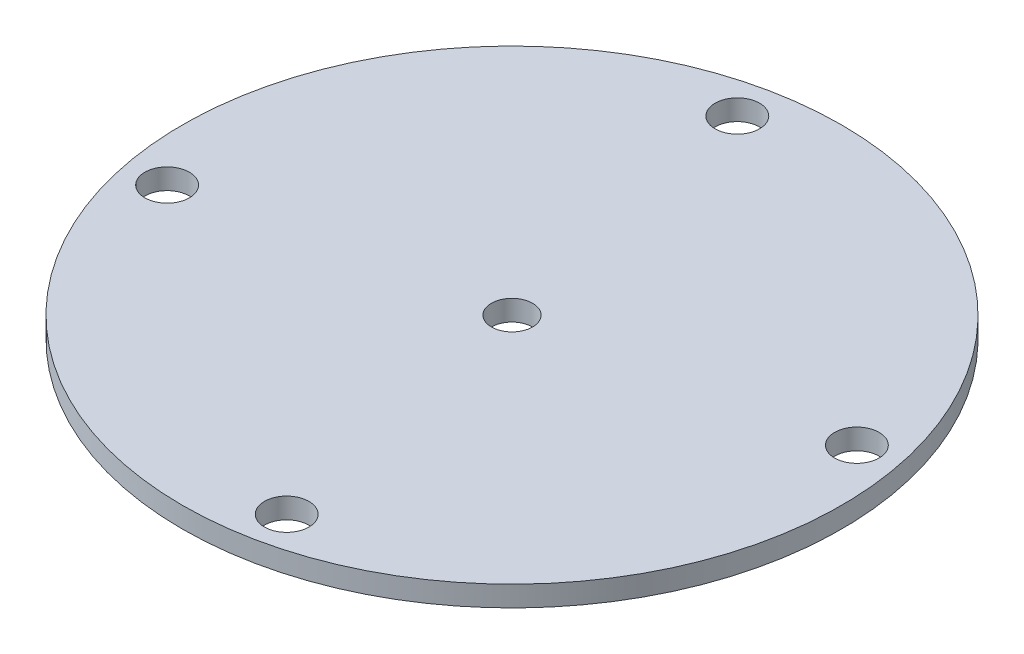
ISO-10303-21;
HEADER;
FILE_DESCRIPTION(('STEP AP214'),'2;1');
FILE_NAME('part.step','',(''),(''),'','','');
FILE_SCHEMA(('AUTOMOTIVE_DESIGN { 1 0 10303 214 1 1 1 1 }'));
ENDSEC;
DATA;
#1=APPLICATION_CONTEXT('core data for automotive mechanical design processes');
#2=APPLICATION_PROTOCOL_DEFINITION('international standard','automotive_design',2000,#1);
#3=PRODUCT_CONTEXT('',#1,'mechanical');
#4=PRODUCT('Part','Part','',(#3));
#5=PRODUCT_RELATED_PRODUCT_CATEGORY('part','',(#4));
#6=PRODUCT_DEFINITION_FORMATION('','',#4);
#7=PRODUCT_DEFINITION_CONTEXT('part definition',#1,'design');
#8=PRODUCT_DEFINITION('design','',#6,#7);
#9=PRODUCT_DEFINITION_SHAPE('','',#8);
#10=(LENGTH_UNIT() NAMED_UNIT(*) SI_UNIT(.MILLI.,.METRE.));
#11=(NAMED_UNIT(*) PLANE_ANGLE_UNIT() SI_UNIT($,.RADIAN.));
#12=(NAMED_UNIT(*) SI_UNIT($,.STERADIAN.) SOLID_ANGLE_UNIT());
#13=UNCERTAINTY_MEASURE_WITH_UNIT(LENGTH_MEASURE(1.E-05),#10,'distance_accuracy_value','');
#14=(GEOMETRIC_REPRESENTATION_CONTEXT(3) GLOBAL_UNCERTAINTY_ASSIGNED_CONTEXT((#13)) GLOBAL_UNIT_ASSIGNED_CONTEXT((#10,
#11,#12)) REPRESENTATION_CONTEXT('',''));
#15=CARTESIAN_POINT('',(0.,0.,0.));
#16=DIRECTION('',(0.,0.,1.));
#17=DIRECTION('',(1.,0.,0.));
#18=AXIS2_PLACEMENT_3D('',#15,#16,#17);
#19=CARTESIAN_POINT('',(0.,3.175,0.));
#20=DIRECTION('',(0.,1.,0.));
#21=DIRECTION('',(0.,0.,1.));
#22=AXIS2_PLACEMENT_3D('',#19,#20,#21);
#23=PLANE('',#22);
#24=CARTESIAN_POINT('',(9.21464266183947,3.175,43.9455954631929));
#25=DIRECTION('',(0.,1.,0.));
#26=DIRECTION('',(0.,0.,1.));
#27=AXIS2_PLACEMENT_3D('',#24,#25,#26);
#28=CIRCLE('',#27,3.429);
#29=CARTESIAN_POINT('',(9.21464266183947,3.175,47.3745954631929));
#30=VERTEX_POINT('',#29);
#31=EDGE_CURVE('E74',#30,#30,#28,.T.);
#32=ORIENTED_EDGE('',*,*,#31,.F.);
#33=EDGE_LOOP('',(#32));
#34=FACE_BOUND('',#33,.T.);
#35=CARTESIAN_POINT('',(43.9455954631928,3.175,-9.2146426618397));
#36=DIRECTION('',(0.,1.,0.));
#37=DIRECTION('',(0.,0.,1.));
#38=AXIS2_PLACEMENT_3D('',#35,#36,#37);
#39=CIRCLE('',#38,3.429);
#40=CARTESIAN_POINT('',(43.9455954631928,3.175,-5.7856426618397));
#41=VERTEX_POINT('',#40);
#42=EDGE_CURVE('E68',#41,#41,#39,.T.);
#43=ORIENTED_EDGE('',*,*,#42,.F.);
#44=EDGE_LOOP('',(#43));
#45=FACE_BOUND('',#44,.T.);
#46=CARTESIAN_POINT('',(-43.9455954631932,3.175,9.21464266183964));
#47=DIRECTION('',(0.,1.,0.));
#48=DIRECTION('',(0.,0.,1.));
#49=AXIS2_PLACEMENT_3D('',#46,#47,#48);
#50=CIRCLE('',#49,3.429);
#51=CARTESIAN_POINT('',(-43.9455954631932,3.175,12.6436426618396));
#52=VERTEX_POINT('',#51);
#53=EDGE_CURVE('E62',#52,#52,#50,.T.);
#54=ORIENTED_EDGE('',*,*,#53,.F.);
#55=EDGE_LOOP('',(#54));
#56=FACE_BOUND('',#55,.T.);
#57=CARTESIAN_POINT('',(-9.21464266183987,3.175,-43.945595463193));
#58=DIRECTION('',(0.,1.,0.));
#59=DIRECTION('',(0.,0.,1.));
#60=AXIS2_PLACEMENT_3D('',#57,#58,#59);
#61=CIRCLE('',#60,3.429);
#62=CARTESIAN_POINT('',(-9.21464266183987,3.175,-40.516595463193));
#63=VERTEX_POINT('',#62);
#64=EDGE_CURVE('E56',#63,#63,#61,.T.);
#65=ORIENTED_EDGE('',*,*,#64,.F.);
#66=EDGE_LOOP('',(#65));
#67=FACE_BOUND('',#66,.T.);
#68=CARTESIAN_POINT('',(0.,3.175,0.));
#69=DIRECTION('',(0.,1.,0.));
#70=DIRECTION('',(0.,0.,1.));
#71=AXIS2_PLACEMENT_3D('',#68,#69,#70);
#72=CIRCLE('',#71,50.8);
#73=CARTESIAN_POINT('',(0.,3.175,50.8));
#74=VERTEX_POINT('',#73);
#75=EDGE_CURVE('E11',#74,#74,#72,.T.);
#76=ORIENTED_EDGE('',*,*,#75,.T.);
#77=EDGE_LOOP('',(#76));
#78=FACE_BOUND('',#77,.T.);
#79=CARTESIAN_POINT('',(0.,3.175,0.));
#80=DIRECTION('',(0.,1.,0.));
#81=DIRECTION('',(0.,0.,1.));
#82=AXIS2_PLACEMENT_3D('',#79,#80,#81);
#83=CIRCLE('',#82,3.175);
#84=CARTESIAN_POINT('',(0.,3.175,3.175));
#85=VERTEX_POINT('',#84);
#86=EDGE_CURVE('E48',#85,#85,#83,.T.);
#87=ORIENTED_EDGE('',*,*,#86,.F.);
#88=EDGE_LOOP('',(#87));
#89=FACE_BOUND('',#88,.T.);
#90=ADVANCED_FACE('F37',(#34,#45,#56,#67,#78,#89),#23,.T.);
#91=CARTESIAN_POINT('',(0.,0.,0.));
#92=DIRECTION('',(0.,1.,0.));
#93=DIRECTION('',(0.,0.,1.));
#94=AXIS2_PLACEMENT_3D('',#91,#92,#93);
#95=PLANE('',#94);
#96=CARTESIAN_POINT('',(9.21464266183947,0.,43.9455954631929));
#97=DIRECTION('',(0.,1.,0.));
#98=DIRECTION('',(0.,0.,1.));
#99=AXIS2_PLACEMENT_3D('',#96,#97,#98);
#100=CIRCLE('',#99,3.429);
#101=CARTESIAN_POINT('',(9.21464266183947,0.,47.3745954631929));
#102=VERTEX_POINT('',#101);
#103=EDGE_CURVE('E71',#102,#102,#100,.T.);
#104=ORIENTED_EDGE('',*,*,#103,.T.);
#105=EDGE_LOOP('',(#104));
#106=FACE_BOUND('',#105,.T.);
#107=CARTESIAN_POINT('',(43.9455954631928,0.,-9.2146426618397));
#108=DIRECTION('',(0.,1.,0.));
#109=DIRECTION('',(0.,0.,1.));
#110=AXIS2_PLACEMENT_3D('',#107,#108,#109);
#111=CIRCLE('',#110,3.429);
#112=CARTESIAN_POINT('',(43.9455954631928,0.,-5.7856426618397));
#113=VERTEX_POINT('',#112);
#114=EDGE_CURVE('E65',#113,#113,#111,.T.);
#115=ORIENTED_EDGE('',*,*,#114,.T.);
#116=EDGE_LOOP('',(#115));
#117=FACE_BOUND('',#116,.T.);
#118=CARTESIAN_POINT('',(-43.9455954631932,0.,9.21464266183964));
#119=DIRECTION('',(0.,1.,0.));
#120=DIRECTION('',(0.,0.,1.));
#121=AXIS2_PLACEMENT_3D('',#118,#119,#120);
#122=CIRCLE('',#121,3.429);
#123=CARTESIAN_POINT('',(-43.9455954631932,0.,12.6436426618396));
#124=VERTEX_POINT('',#123);
#125=EDGE_CURVE('E59',#124,#124,#122,.T.);
#126=ORIENTED_EDGE('',*,*,#125,.T.);
#127=EDGE_LOOP('',(#126));
#128=FACE_BOUND('',#127,.T.);
#129=CARTESIAN_POINT('',(-9.21464266183987,0.,-43.945595463193));
#130=DIRECTION('',(0.,1.,0.));
#131=DIRECTION('',(0.,0.,1.));
#132=AXIS2_PLACEMENT_3D('',#129,#130,#131);
#133=CIRCLE('',#132,3.429);
#134=CARTESIAN_POINT('',(-9.21464266183987,0.,-40.516595463193));
#135=VERTEX_POINT('',#134);
#136=EDGE_CURVE('E53',#135,#135,#133,.T.);
#137=ORIENTED_EDGE('',*,*,#136,.T.);
#138=EDGE_LOOP('',(#137));
#139=FACE_BOUND('',#138,.T.);
#140=CARTESIAN_POINT('',(0.,0.,0.));
#141=DIRECTION('',(0.,1.,0.));
#142=DIRECTION('',(0.,0.,1.));
#143=AXIS2_PLACEMENT_3D('',#140,#141,#142);
#144=CIRCLE('',#143,50.8);
#145=CARTESIAN_POINT('',(0.,0.,50.8));
#146=VERTEX_POINT('',#145);
#147=EDGE_CURVE('E41',#146,#146,#144,.T.);
#148=ORIENTED_EDGE('',*,*,#147,.F.);
#149=EDGE_LOOP('',(#148));
#150=FACE_BOUND('',#149,.T.);
#151=CARTESIAN_POINT('',(0.,0.,0.));
#152=DIRECTION('',(0.,1.,0.));
#153=DIRECTION('',(0.,0.,1.));
#154=AXIS2_PLACEMENT_3D('',#151,#152,#153);
#155=CIRCLE('',#154,3.175);
#156=CARTESIAN_POINT('',(0.,0.,3.175));
#157=VERTEX_POINT('',#156);
#158=EDGE_CURVE('E50',#157,#157,#155,.T.);
#159=ORIENTED_EDGE('',*,*,#158,.T.);
#160=EDGE_LOOP('',(#159));
#161=FACE_BOUND('',#160,.T.);
#162=ADVANCED_FACE('F80',(#106,#117,#128,#139,#150,#161),#95,.F.);
#163=CARTESIAN_POINT('',(0.,3.175,0.));
#164=DIRECTION('',(0.,-1.,0.));
#165=DIRECTION('',(0.,0.,-1.));
#166=AXIS2_PLACEMENT_3D('',#163,#164,#165);
#167=CYLINDRICAL_SURFACE('',#166,50.8);
#168=ORIENTED_EDGE('',*,*,#75,.F.);
#169=EDGE_LOOP('',(#168));
#170=FACE_BOUND('',#169,.T.);
#171=ORIENTED_EDGE('',*,*,#147,.T.);
#172=EDGE_LOOP('',(#171));
#173=FACE_BOUND('',#172,.T.);
#174=ADVANCED_FACE('F39',(#170,#173),#167,.T.);
#175=CARTESIAN_POINT('',(0.,3.175,0.));
#176=DIRECTION('',(0.,-1.,0.));
#177=DIRECTION('',(0.,0.,-1.));
#178=AXIS2_PLACEMENT_3D('',#175,#176,#177);
#179=CYLINDRICAL_SURFACE('',#178,3.175);
#180=ORIENTED_EDGE('',*,*,#86,.T.);
#181=EDGE_LOOP('',(#180));
#182=FACE_BOUND('',#181,.T.);
#183=ORIENTED_EDGE('',*,*,#158,.F.);
#184=EDGE_LOOP('',(#183));
#185=FACE_BOUND('',#184,.T.);
#186=ADVANCED_FACE('F101',(#182,#185),#179,.F.);
#187=CARTESIAN_POINT('',(-9.21464266183987,0.,-43.945595463193));
#188=DIRECTION('',(0.,1.,0.));
#189=DIRECTION('',(0.,0.,1.));
#190=AXIS2_PLACEMENT_3D('',#187,#188,#189);
#191=CYLINDRICAL_SURFACE('',#190,3.429);
#192=ORIENTED_EDGE('',*,*,#136,.F.);
#193=EDGE_LOOP('',(#192));
#194=FACE_BOUND('',#193,.T.);
#195=ORIENTED_EDGE('',*,*,#64,.T.);
#196=EDGE_LOOP('',(#195));
#197=FACE_BOUND('',#196,.T.);
#198=ADVANCED_FACE('F104',(#194,#197),#191,.F.);
#199=CARTESIAN_POINT('',(-43.9455954631932,0.,9.21464266183964));
#200=DIRECTION('',(0.,1.,0.));
#201=DIRECTION('',(0.,0.,1.));
#202=AXIS2_PLACEMENT_3D('',#199,#200,#201);
#203=CYLINDRICAL_SURFACE('',#202,3.429);
#204=ORIENTED_EDGE('',*,*,#125,.F.);
#205=EDGE_LOOP('',(#204));
#206=FACE_BOUND('',#205,.T.);
#207=ORIENTED_EDGE('',*,*,#53,.T.);
#208=EDGE_LOOP('',(#207));
#209=FACE_BOUND('',#208,.T.);
#210=ADVANCED_FACE('F116',(#206,#209),#203,.F.);
#211=CARTESIAN_POINT('',(43.9455954631928,0.,-9.2146426618397));
#212=DIRECTION('',(0.,1.,0.));
#213=DIRECTION('',(0.,0.,1.));
#214=AXIS2_PLACEMENT_3D('',#211,#212,#213);
#215=CYLINDRICAL_SURFACE('',#214,3.429);
#216=ORIENTED_EDGE('',*,*,#114,.F.);
#217=EDGE_LOOP('',(#216));
#218=FACE_BOUND('',#217,.T.);
#219=ORIENTED_EDGE('',*,*,#42,.T.);
#220=EDGE_LOOP('',(#219));
#221=FACE_BOUND('',#220,.T.);
#222=ADVANCED_FACE('F86',(#218,#221),#215,.F.);
#223=CARTESIAN_POINT('',(9.21464266183947,0.,43.9455954631929));
#224=DIRECTION('',(0.,1.,0.));
#225=DIRECTION('',(0.,0.,1.));
#226=AXIS2_PLACEMENT_3D('',#223,#224,#225);
#227=CYLINDRICAL_SURFACE('',#226,3.429);
#228=ORIENTED_EDGE('',*,*,#103,.F.);
#229=EDGE_LOOP('',(#228));
#230=FACE_BOUND('',#229,.T.);
#231=ORIENTED_EDGE('',*,*,#31,.T.);
#232=EDGE_LOOP('',(#231));
#233=FACE_BOUND('',#232,.T.);
#234=ADVANCED_FACE('F83',(#230,#233),#227,.F.);
#235=CLOSED_SHELL('',(#90,#162,#174,#186,#198,#210,#222,#234));
#236=MANIFOLD_SOLID_BREP('B2',#235);
#237=ADVANCED_BREP_SHAPE_REPRESENTATION('',(#18,#236),#14);
#238=SHAPE_DEFINITION_REPRESENTATION(#9,#237);
ENDSEC;
END-ISO-10303-21;
